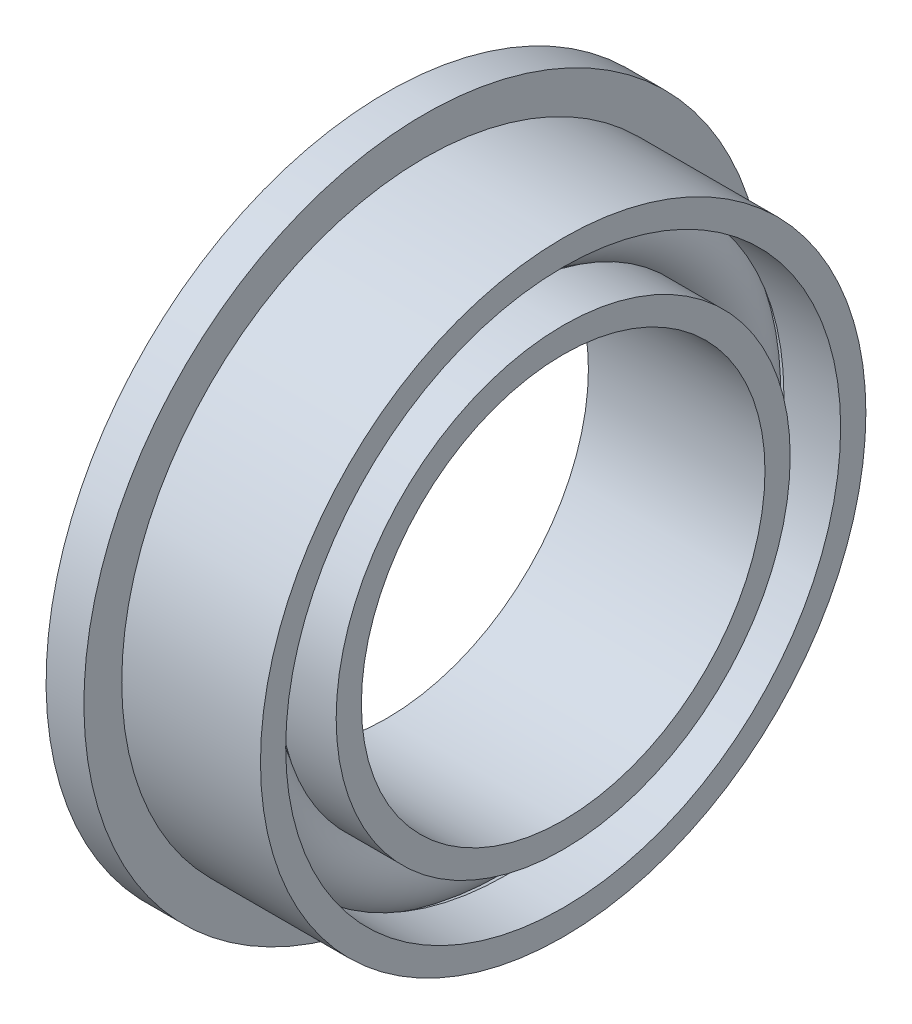
ISO-10303-21;
HEADER;
FILE_DESCRIPTION(('STEP AP214'),'2;1');
FILE_NAME('part.step','',(''),(''),'','','');
FILE_SCHEMA(('AUTOMOTIVE_DESIGN { 1 0 10303 214 1 1 1 1 }'));
ENDSEC;
DATA;
#1=APPLICATION_CONTEXT('core data for automotive mechanical design processes');
#2=APPLICATION_PROTOCOL_DEFINITION('international standard','automotive_design',2000,#1);
#3=PRODUCT_CONTEXT('',#1,'mechanical');
#4=PRODUCT('Part','Part','',(#3));
#5=PRODUCT_RELATED_PRODUCT_CATEGORY('part','',(#4));
#6=PRODUCT_DEFINITION_FORMATION('','',#4);
#7=PRODUCT_DEFINITION_CONTEXT('part definition',#1,'design');
#8=PRODUCT_DEFINITION('design','',#6,#7);
#9=PRODUCT_DEFINITION_SHAPE('','',#8);
#10=(LENGTH_UNIT() NAMED_UNIT(*) SI_UNIT(.MILLI.,.METRE.));
#11=(NAMED_UNIT(*) PLANE_ANGLE_UNIT() SI_UNIT($,.RADIAN.));
#12=(NAMED_UNIT(*) SI_UNIT($,.STERADIAN.) SOLID_ANGLE_UNIT());
#13=UNCERTAINTY_MEASURE_WITH_UNIT(LENGTH_MEASURE(1.E-05),#10,'distance_accuracy_value','');
#14=(GEOMETRIC_REPRESENTATION_CONTEXT(3) GLOBAL_UNCERTAINTY_ASSIGNED_CONTEXT((#13)) GLOBAL_UNIT_ASSIGNED_CONTEXT((#10,
#11,#12)) REPRESENTATION_CONTEXT('',''));
#15=CARTESIAN_POINT('',(0.,0.,0.));
#16=DIRECTION('',(0.,0.,1.));
#17=DIRECTION('',(1.,0.,0.));
#18=AXIS2_PLACEMENT_3D('',#15,#16,#17);
#19=CARTESIAN_POINT('',(0.,0.,0.));
#20=DIRECTION('',(-1.,0.,0.));
#21=DIRECTION('',(0.,-1.,0.));
#22=AXIS2_PLACEMENT_3D('',#19,#20,#21);
#23=TOROIDAL_SURFACE('',#22,5.,0.75);
#24=CARTESIAN_POINT('',(0.,-5.75,0.));
#25=VERTEX_POINT('',#24);
#26=VERTEX_LOOP('',#25);
#27=FACE_BOUND('',#26,.T.);
#28=ADVANCED_FACE('F41',(#27),#23,.T.);
#29=CLOSED_SHELL('',(#28));
#30=MANIFOLD_SOLID_BREP('B2',#29);
#31=CARTESIAN_POINT('',(0.,0.,0.));
#32=DIRECTION('',(-1.,0.,0.));
#33=DIRECTION('',(0.,-1.,0.));
#34=AXIS2_PLACEMENT_3D('',#31,#32,#33);
#35=TOROIDAL_SURFACE('',#34,5.,0.799999999999998);
#36=CARTESIAN_POINT('',(-0.624499799839834,0.,0.));
#37=DIRECTION('',(-1.,0.,0.));
#38=DIRECTION('',(0.,-1.,0.));
#39=AXIS2_PLACEMENT_3D('',#36,#37,#38);
#40=CIRCLE('',#39,5.5);
#41=CARTESIAN_POINT('',(-0.624499799839833,-5.49999999999999,0.));
#42=VERTEX_POINT('',#41);
#43=EDGE_CURVE('E88',#42,#42,#40,.T.);
#44=ORIENTED_EDGE('',*,*,#43,.T.);
#45=EDGE_LOOP('',(#44));
#46=FACE_BOUND('',#45,.T.);
#47=CARTESIAN_POINT('',(0.624499799839841,0.,0.));
#48=DIRECTION('',(-1.,0.,0.));
#49=DIRECTION('',(0.,-1.,0.));
#50=AXIS2_PLACEMENT_3D('',#47,#48,#49);
#51=CIRCLE('',#50,5.5);
#52=CARTESIAN_POINT('',(0.624499799839842,-5.49999999999999,0.));
#53=VERTEX_POINT('',#52);
#54=EDGE_CURVE('E40',#53,#53,#51,.T.);
#55=ORIENTED_EDGE('',*,*,#54,.F.);
#56=EDGE_LOOP('',(#55));
#57=FACE_BOUND('',#56,.T.);
#58=ADVANCED_FACE('F60',(#46,#57),#35,.F.);
#59=CARTESIAN_POINT('',(-42.1111893033075,0.,0.));
#60=DIRECTION('',(-1.,0.,0.));
#61=DIRECTION('',(0.,-1.,0.));
#62=AXIS2_PLACEMENT_3D('',#59,#60,#61);
#63=CYLINDRICAL_SURFACE('',#62,5.5);
#64=ORIENTED_EDGE('',*,*,#54,.T.);
#65=EDGE_LOOP('',(#64));
#66=FACE_BOUND('',#65,.T.);
#67=CARTESIAN_POINT('',(1.75,0.,0.));
#68=DIRECTION('',(-1.,0.,0.));
#69=DIRECTION('',(0.,-1.,0.));
#70=AXIS2_PLACEMENT_3D('',#67,#68,#69);
#71=CIRCLE('',#70,5.5);
#72=CARTESIAN_POINT('',(1.75,-5.5,0.));
#73=VERTEX_POINT('',#72);
#74=EDGE_CURVE('E66',#73,#73,#71,.T.);
#75=ORIENTED_EDGE('',*,*,#74,.F.);
#76=EDGE_LOOP('',(#75));
#77=FACE_BOUND('',#76,.T.);
#78=ADVANCED_FACE('F106',(#66,#77),#63,.F.);
#79=CARTESIAN_POINT('',(1.75000000000001,0.,0.));
#80=DIRECTION('',(1.,0.,0.));
#81=DIRECTION('',(0.,1.,0.));
#82=AXIS2_PLACEMENT_3D('',#79,#80,#81);
#83=PLANE('',#82);
#84=ORIENTED_EDGE('',*,*,#74,.T.);
#85=EDGE_LOOP('',(#84));
#86=FACE_BOUND('',#85,.T.);
#87=CARTESIAN_POINT('',(1.75,0.,0.));
#88=DIRECTION('',(-1.,0.,0.));
#89=DIRECTION('',(0.,-1.,0.));
#90=AXIS2_PLACEMENT_3D('',#87,#88,#89);
#91=CIRCLE('',#90,6.);
#92=CARTESIAN_POINT('',(1.75,-5.99999999999999,0.));
#93=VERTEX_POINT('',#92);
#94=EDGE_CURVE('E70',#93,#93,#91,.T.);
#95=ORIENTED_EDGE('',*,*,#94,.F.);
#96=EDGE_LOOP('',(#95));
#97=FACE_BOUND('',#96,.T.);
#98=ADVANCED_FACE('F110',(#86,#97),#83,.T.);
#99=CARTESIAN_POINT('',(-42.1111893033075,0.,0.));
#100=DIRECTION('',(-1.,0.,0.));
#101=DIRECTION('',(0.,-1.,0.));
#102=AXIS2_PLACEMENT_3D('',#99,#100,#101);
#103=CYLINDRICAL_SURFACE('',#102,6.);
#104=ORIENTED_EDGE('',*,*,#94,.T.);
#105=EDGE_LOOP('',(#104));
#106=FACE_BOUND('',#105,.T.);
#107=CARTESIAN_POINT('',(-0.999999999999994,0.,0.));
#108=DIRECTION('',(-1.,0.,0.));
#109=DIRECTION('',(0.,-1.,0.));
#110=AXIS2_PLACEMENT_3D('',#107,#108,#109);
#111=CIRCLE('',#110,6.);
#112=CARTESIAN_POINT('',(-0.999999999999993,-5.99999999999999,0.));
#113=VERTEX_POINT('',#112);
#114=EDGE_CURVE('E74',#113,#113,#111,.T.);
#115=ORIENTED_EDGE('',*,*,#114,.F.);
#116=EDGE_LOOP('',(#115));
#117=FACE_BOUND('',#116,.T.);
#118=ADVANCED_FACE('F114',(#106,#117),#103,.T.);
#119=CARTESIAN_POINT('',(-0.999999999999995,0.,0.));
#120=DIRECTION('',(1.,0.,0.));
#121=DIRECTION('',(0.,1.,0.));
#122=AXIS2_PLACEMENT_3D('',#119,#120,#121);
#123=PLANE('',#122);
#124=ORIENTED_EDGE('',*,*,#114,.T.);
#125=EDGE_LOOP('',(#124));
#126=FACE_BOUND('',#125,.T.);
#127=CARTESIAN_POINT('',(-0.999999999999994,0.,0.));
#128=DIRECTION('',(-1.,0.,0.));
#129=DIRECTION('',(0.,-1.,0.));
#130=AXIS2_PLACEMENT_3D('',#127,#128,#129);
#131=CIRCLE('',#130,6.75);
#132=CARTESIAN_POINT('',(-0.999999999999993,-6.74999999999999,0.));
#133=VERTEX_POINT('',#132);
#134=EDGE_CURVE('E79',#133,#133,#131,.T.);
#135=ORIENTED_EDGE('',*,*,#134,.F.);
#136=EDGE_LOOP('',(#135));
#137=FACE_BOUND('',#136,.T.);
#138=ADVANCED_FACE('F120',(#126,#137),#123,.T.);
#139=CARTESIAN_POINT('',(-42.1111893033075,0.,0.));
#140=DIRECTION('',(-1.,0.,0.));
#141=DIRECTION('',(0.,-1.,0.));
#142=AXIS2_PLACEMENT_3D('',#139,#140,#141);
#143=CYLINDRICAL_SURFACE('',#142,6.75);
#144=ORIENTED_EDGE('',*,*,#134,.T.);
#145=EDGE_LOOP('',(#144));
#146=FACE_BOUND('',#145,.T.);
#147=CARTESIAN_POINT('',(-1.74999999999999,0.,0.));
#148=DIRECTION('',(-1.,0.,0.));
#149=DIRECTION('',(0.,-1.,0.));
#150=AXIS2_PLACEMENT_3D('',#147,#148,#149);
#151=CIRCLE('',#150,6.75);
#152=CARTESIAN_POINT('',(-1.74999999999999,-6.74999999999999,0.));
#153=VERTEX_POINT('',#152);
#154=EDGE_CURVE('E82',#153,#153,#151,.T.);
#155=ORIENTED_EDGE('',*,*,#154,.F.);
#156=EDGE_LOOP('',(#155));
#157=FACE_BOUND('',#156,.T.);
#158=ADVANCED_FACE('F102',(#146,#157),#143,.T.);
#159=CARTESIAN_POINT('',(-1.74999999999999,0.,0.));
#160=DIRECTION('',(-1.,0.,0.));
#161=DIRECTION('',(0.,-1.,0.));
#162=AXIS2_PLACEMENT_3D('',#159,#160,#161);
#163=PLANE('',#162);
#164=ORIENTED_EDGE('',*,*,#154,.T.);
#165=EDGE_LOOP('',(#164));
#166=FACE_BOUND('',#165,.T.);
#167=CARTESIAN_POINT('',(-1.74999999999999,0.,0.));
#168=DIRECTION('',(-1.,0.,0.));
#169=DIRECTION('',(0.,-1.,0.));
#170=AXIS2_PLACEMENT_3D('',#167,#168,#169);
#171=CIRCLE('',#170,5.5);
#172=CARTESIAN_POINT('',(-1.74999999999999,-5.5,0.));
#173=VERTEX_POINT('',#172);
#174=EDGE_CURVE('E85',#173,#173,#171,.T.);
#175=ORIENTED_EDGE('',*,*,#174,.F.);
#176=EDGE_LOOP('',(#175));
#177=FACE_BOUND('',#176,.T.);
#178=ADVANCED_FACE('F96',(#166,#177),#163,.T.);
#179=CARTESIAN_POINT('',(-42.1111893033075,0.,0.));
#180=DIRECTION('',(-1.,0.,0.));
#181=DIRECTION('',(0.,-1.,0.));
#182=AXIS2_PLACEMENT_3D('',#179,#180,#181);
#183=CYLINDRICAL_SURFACE('',#182,5.5);
#184=ORIENTED_EDGE('',*,*,#174,.T.);
#185=EDGE_LOOP('',(#184));
#186=FACE_BOUND('',#185,.T.);
#187=ORIENTED_EDGE('',*,*,#43,.F.);
#188=EDGE_LOOP('',(#187));
#189=FACE_BOUND('',#188,.T.);
#190=ADVANCED_FACE('F94',(#186,#189),#183,.F.);
#191=CLOSED_SHELL('',(#58,#78,#98,#118,#138,#158,#178,#190));
#192=MANIFOLD_SOLID_BREP('B6',#191);
#193=CARTESIAN_POINT('',(-42.1111893033075,0.,0.));
#194=DIRECTION('',(-1.,0.,0.));
#195=DIRECTION('',(0.,-1.,0.));
#196=AXIS2_PLACEMENT_3D('',#193,#194,#195);
#197=CYLINDRICAL_SURFACE('',#196,4.5);
#198=CARTESIAN_POINT('',(0.624499799839841,0.,0.));
#199=DIRECTION('',(-1.,0.,0.));
#200=DIRECTION('',(0.,-1.,0.));
#201=AXIS2_PLACEMENT_3D('',#198,#199,#200);
#202=CIRCLE('',#201,4.5);
#203=CARTESIAN_POINT('',(0.624499799839842,-4.49999999999999,0.));
#204=VERTEX_POINT('',#203);
#205=EDGE_CURVE('E59',#204,#204,#202,.T.);
#206=ORIENTED_EDGE('',*,*,#205,.F.);
#207=EDGE_LOOP('',(#206));
#208=FACE_BOUND('',#207,.T.);
#209=CARTESIAN_POINT('',(1.75,0.,0.));
#210=DIRECTION('',(-1.,0.,0.));
#211=DIRECTION('',(0.,-1.,0.));
#212=AXIS2_PLACEMENT_3D('',#209,#210,#211);
#213=CIRCLE('',#212,4.5);
#214=CARTESIAN_POINT('',(1.75,-4.5,0.));
#215=VERTEX_POINT('',#214);
#216=EDGE_CURVE('E203',#215,#215,#213,.T.);
#217=ORIENTED_EDGE('',*,*,#216,.T.);
#218=EDGE_LOOP('',(#217));
#219=FACE_BOUND('',#218,.T.);
#220=ADVANCED_FACE('F181',(#208,#219),#197,.T.);
#221=CARTESIAN_POINT('',(0.,0.,0.));
#222=DIRECTION('',(-1.,0.,0.));
#223=DIRECTION('',(0.,-1.,0.));
#224=AXIS2_PLACEMENT_3D('',#221,#222,#223);
#225=TOROIDAL_SURFACE('',#224,5.,0.8);
#226=CARTESIAN_POINT('',(-0.624499799839834,0.,0.));
#227=DIRECTION('',(-1.,0.,0.));
#228=DIRECTION('',(0.,-1.,0.));
#229=AXIS2_PLACEMENT_3D('',#226,#227,#228);
#230=CIRCLE('',#229,4.5);
#231=CARTESIAN_POINT('',(-0.624499799839833,-4.49999999999999,0.));
#232=VERTEX_POINT('',#231);
#233=EDGE_CURVE('E187',#232,#232,#230,.T.);
#234=ORIENTED_EDGE('',*,*,#233,.F.);
#235=EDGE_LOOP('',(#234));
#236=FACE_BOUND('',#235,.T.);
#237=ORIENTED_EDGE('',*,*,#205,.T.);
#238=EDGE_LOOP('',(#237));
#239=FACE_BOUND('',#238,.T.);
#240=ADVANCED_FACE('F228',(#236,#239),#225,.F.);
#241=CARTESIAN_POINT('',(-42.1111893033075,0.,0.));
#242=DIRECTION('',(-1.,0.,0.));
#243=DIRECTION('',(0.,-1.,0.));
#244=AXIS2_PLACEMENT_3D('',#241,#242,#243);
#245=CYLINDRICAL_SURFACE('',#244,4.5);
#246=CARTESIAN_POINT('',(-1.74999999999999,0.,0.));
#247=DIRECTION('',(-1.,0.,0.));
#248=DIRECTION('',(0.,-1.,0.));
#249=AXIS2_PLACEMENT_3D('',#246,#247,#248);
#250=CIRCLE('',#249,4.5);
#251=CARTESIAN_POINT('',(-1.74999999999999,-4.49999999999999,0.));
#252=VERTEX_POINT('',#251);
#253=EDGE_CURVE('E191',#252,#252,#250,.T.);
#254=ORIENTED_EDGE('',*,*,#253,.F.);
#255=EDGE_LOOP('',(#254));
#256=FACE_BOUND('',#255,.T.);
#257=ORIENTED_EDGE('',*,*,#233,.T.);
#258=EDGE_LOOP('',(#257));
#259=FACE_BOUND('',#258,.T.);
#260=ADVANCED_FACE('F223',(#256,#259),#245,.T.);
#261=CARTESIAN_POINT('',(-1.75,0.,0.));
#262=DIRECTION('',(1.,0.,0.));
#263=DIRECTION('',(0.,1.,0.));
#264=AXIS2_PLACEMENT_3D('',#261,#262,#263);
#265=PLANE('',#264);
#266=CARTESIAN_POINT('',(-1.74999999999999,0.,0.));
#267=DIRECTION('',(-1.,0.,0.));
#268=DIRECTION('',(0.,-1.,0.));
#269=AXIS2_PLACEMENT_3D('',#266,#267,#268);
#270=CIRCLE('',#269,4.);
#271=CARTESIAN_POINT('',(-1.74999999999999,-3.99999999999999,0.));
#272=VERTEX_POINT('',#271);
#273=EDGE_CURVE('E195',#272,#272,#270,.T.);
#274=ORIENTED_EDGE('',*,*,#273,.F.);
#275=EDGE_LOOP('',(#274));
#276=FACE_BOUND('',#275,.T.);
#277=ORIENTED_EDGE('',*,*,#253,.T.);
#278=EDGE_LOOP('',(#277));
#279=FACE_BOUND('',#278,.T.);
#280=ADVANCED_FACE('F217',(#276,#279),#265,.F.);
#281=CARTESIAN_POINT('',(-42.1111893033075,0.,0.));
#282=DIRECTION('',(-1.,0.,0.));
#283=DIRECTION('',(0.,-1.,0.));
#284=AXIS2_PLACEMENT_3D('',#281,#282,#283);
#285=CYLINDRICAL_SURFACE('',#284,4.);
#286=CARTESIAN_POINT('',(1.75,0.,0.));
#287=DIRECTION('',(-1.,0.,0.));
#288=DIRECTION('',(0.,-1.,0.));
#289=AXIS2_PLACEMENT_3D('',#286,#287,#288);
#290=CIRCLE('',#289,4.);
#291=CARTESIAN_POINT('',(1.75,-3.99999999999999,0.));
#292=VERTEX_POINT('',#291);
#293=EDGE_CURVE('E200',#292,#292,#290,.T.);
#294=ORIENTED_EDGE('',*,*,#293,.F.);
#295=EDGE_LOOP('',(#294));
#296=FACE_BOUND('',#295,.T.);
#297=ORIENTED_EDGE('',*,*,#273,.T.);
#298=EDGE_LOOP('',(#297));
#299=FACE_BOUND('',#298,.T.);
#300=ADVANCED_FACE('F211',(#296,#299),#285,.F.);
#301=CARTESIAN_POINT('',(1.75000000000001,0.,0.));
#302=DIRECTION('',(-1.,0.,0.));
#303=DIRECTION('',(0.,-1.,0.));
#304=AXIS2_PLACEMENT_3D('',#301,#302,#303);
#305=PLANE('',#304);
#306=ORIENTED_EDGE('',*,*,#216,.F.);
#307=EDGE_LOOP('',(#306));
#308=FACE_BOUND('',#307,.T.);
#309=ORIENTED_EDGE('',*,*,#293,.T.);
#310=EDGE_LOOP('',(#309));
#311=FACE_BOUND('',#310,.T.);
#312=ADVANCED_FACE('F208',(#308,#311),#305,.F.);
#313=CLOSED_SHELL('',(#220,#240,#260,#280,#300,#312));
#314=MANIFOLD_SOLID_BREP('B35',#313);
#315=ADVANCED_BREP_SHAPE_REPRESENTATION('',(#18,#30,#192,#314),#14);
#316=SHAPE_DEFINITION_REPRESENTATION(#9,#315);
ENDSEC;
END-ISO-10303-21;
